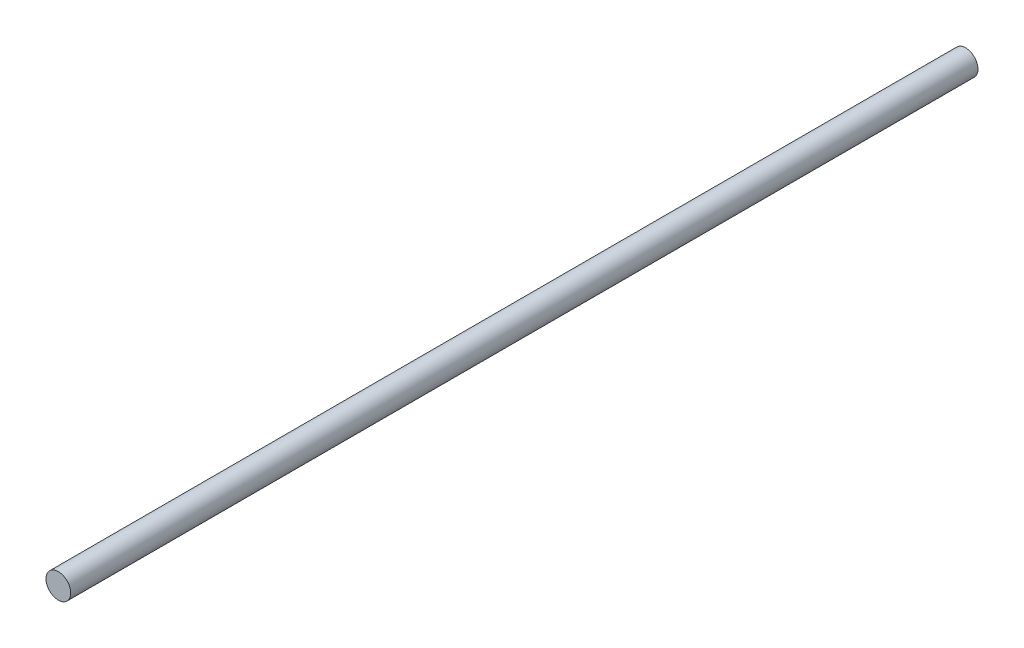
ISO-10303-21;
HEADER;
FILE_DESCRIPTION(('STEP AP214'),'2;1');
FILE_NAME('part.step','',(''),(''),'','','');
FILE_SCHEMA(('AUTOMOTIVE_DESIGN { 1 0 10303 214 1 1 1 1 }'));
ENDSEC;
DATA;
#1=APPLICATION_CONTEXT('core data for automotive mechanical design processes');
#2=APPLICATION_PROTOCOL_DEFINITION('international standard','automotive_design',2000,#1);
#3=PRODUCT_CONTEXT('',#1,'mechanical');
#4=PRODUCT('Part','Part','',(#3));
#5=PRODUCT_RELATED_PRODUCT_CATEGORY('part','',(#4));
#6=PRODUCT_DEFINITION_FORMATION('','',#4);
#7=PRODUCT_DEFINITION_CONTEXT('part definition',#1,'design');
#8=PRODUCT_DEFINITION('design','',#6,#7);
#9=PRODUCT_DEFINITION_SHAPE('','',#8);
#10=(LENGTH_UNIT() NAMED_UNIT(*) SI_UNIT(.MILLI.,.METRE.));
#11=(NAMED_UNIT(*) PLANE_ANGLE_UNIT() SI_UNIT($,.RADIAN.));
#12=(NAMED_UNIT(*) SI_UNIT($,.STERADIAN.) SOLID_ANGLE_UNIT());
#13=UNCERTAINTY_MEASURE_WITH_UNIT(LENGTH_MEASURE(1.E-05),#10,'distance_accuracy_value','');
#14=(GEOMETRIC_REPRESENTATION_CONTEXT(3) GLOBAL_UNCERTAINTY_ASSIGNED_CONTEXT((#13)) GLOBAL_UNIT_ASSIGNED_CONTEXT((#10,
#11,#12)) REPRESENTATION_CONTEXT('',''));
#15=CARTESIAN_POINT('',(0.,0.,0.));
#16=DIRECTION('',(0.,0.,1.));
#17=DIRECTION('',(1.,0.,0.));
#18=AXIS2_PLACEMENT_3D('',#15,#16,#17);
#19=CARTESIAN_POINT('',(0.,0.,220.));
#20=DIRECTION('',(0.,0.,-1.));
#21=DIRECTION('',(-1.,0.,0.));
#22=AXIS2_PLACEMENT_3D('',#19,#20,#21);
#23=CYLINDRICAL_SURFACE('',#22,3.);
#24=CARTESIAN_POINT('',(0.,0.,220.));
#25=DIRECTION('',(0.,0.,1.));
#26=DIRECTION('',(1.,0.,0.));
#27=AXIS2_PLACEMENT_3D('',#24,#25,#26);
#28=CIRCLE('',#27,3.);
#29=CARTESIAN_POINT('',(3.,0.,220.));
#30=VERTEX_POINT('',#29);
#31=EDGE_CURVE('E10',#30,#30,#28,.T.);
#32=ORIENTED_EDGE('',*,*,#31,.F.);
#33=EDGE_LOOP('',(#32));
#34=FACE_BOUND('',#33,.T.);
#35=CARTESIAN_POINT('',(0.,0.,0.));
#36=DIRECTION('',(0.,0.,1.));
#37=DIRECTION('',(1.,0.,0.));
#38=AXIS2_PLACEMENT_3D('',#35,#36,#37);
#39=CIRCLE('',#38,3.);
#40=CARTESIAN_POINT('',(3.,0.,0.));
#41=VERTEX_POINT('',#40);
#42=EDGE_CURVE('E41',#41,#41,#39,.T.);
#43=ORIENTED_EDGE('',*,*,#42,.T.);
#44=EDGE_LOOP('',(#43));
#45=FACE_BOUND('',#44,.T.);
#46=ADVANCED_FACE('F38',(#34,#45),#23,.T.);
#47=CARTESIAN_POINT('',(0.,0.,220.));
#48=DIRECTION('',(0.,0.,1.));
#49=DIRECTION('',(1.,0.,0.));
#50=AXIS2_PLACEMENT_3D('',#47,#48,#49);
#51=PLANE('',#50);
#52=ORIENTED_EDGE('',*,*,#31,.T.);
#53=EDGE_LOOP('',(#52));
#54=FACE_BOUND('',#53,.T.);
#55=ADVANCED_FACE('F55',(#54),#51,.T.);
#56=CARTESIAN_POINT('',(0.,0.,0.));
#57=DIRECTION('',(0.,0.,1.));
#58=DIRECTION('',(1.,0.,0.));
#59=AXIS2_PLACEMENT_3D('',#56,#57,#58);
#60=PLANE('',#59);
#61=ORIENTED_EDGE('',*,*,#42,.F.);
#62=EDGE_LOOP('',(#61));
#63=FACE_BOUND('',#62,.T.);
#64=ADVANCED_FACE('F53',(#63),#60,.F.);
#65=CLOSED_SHELL('',(#46,#55,#64));
#66=MANIFOLD_SOLID_BREP('B2',#65);
#67=ADVANCED_BREP_SHAPE_REPRESENTATION('',(#18,#66),#14);
#68=SHAPE_DEFINITION_REPRESENTATION(#9,#67);
ENDSEC;
END-ISO-10303-21;
